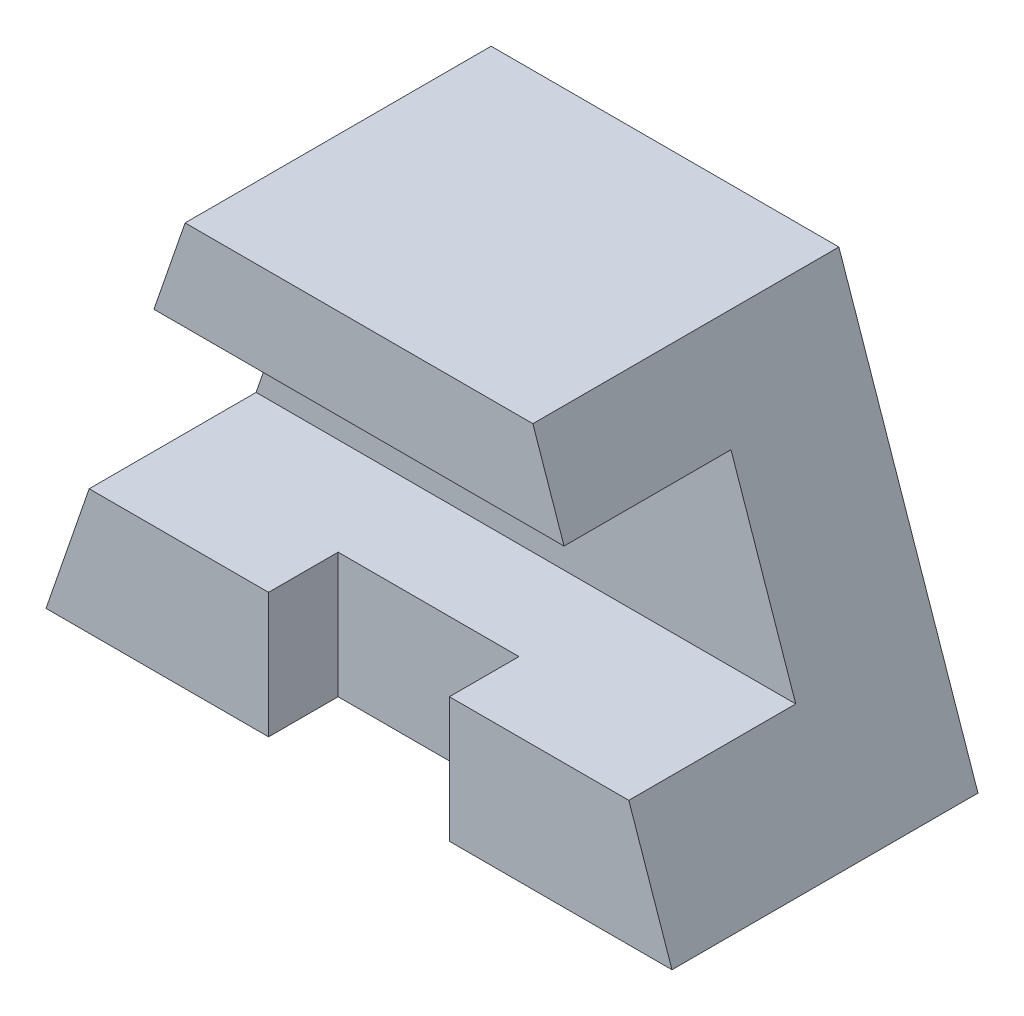
ISO-10303-21;
HEADER;
FILE_DESCRIPTION(('STEP AP214'),'2;1');
FILE_NAME('part.step','',(''),(''),'','','');
FILE_SCHEMA(('AUTOMOTIVE_DESIGN { 1 0 10303 214 1 1 1 1 }'));
ENDSEC;
DATA;
#1=APPLICATION_CONTEXT('core data for automotive mechanical design processes');
#2=APPLICATION_PROTOCOL_DEFINITION('international standard','automotive_design',2000,#1);
#3=PRODUCT_CONTEXT('',#1,'mechanical');
#4=PRODUCT('Part','Part','',(#3));
#5=PRODUCT_RELATED_PRODUCT_CATEGORY('part','',(#4));
#6=PRODUCT_DEFINITION_FORMATION('','',#4);
#7=PRODUCT_DEFINITION_CONTEXT('part definition',#1,'design');
#8=PRODUCT_DEFINITION('design','',#6,#7);
#9=PRODUCT_DEFINITION_SHAPE('','',#8);
#10=(LENGTH_UNIT() NAMED_UNIT(*) SI_UNIT(.MILLI.,.METRE.));
#11=(NAMED_UNIT(*) PLANE_ANGLE_UNIT() SI_UNIT($,.RADIAN.));
#12=(NAMED_UNIT(*) SI_UNIT($,.STERADIAN.) SOLID_ANGLE_UNIT());
#13=UNCERTAINTY_MEASURE_WITH_UNIT(LENGTH_MEASURE(1.E-05),#10,'distance_accuracy_value','');
#14=(GEOMETRIC_REPRESENTATION_CONTEXT(3) GLOBAL_UNCERTAINTY_ASSIGNED_CONTEXT((#13)) GLOBAL_UNIT_ASSIGNED_CONTEXT((#10,
#11,#12)) REPRESENTATION_CONTEXT('',''));
#15=CARTESIAN_POINT('',(0.,0.,0.));
#16=DIRECTION('',(0.,0.,1.));
#17=DIRECTION('',(1.,0.,0.));
#18=AXIS2_PLACEMENT_3D('',#15,#16,#17);
#19=CARTESIAN_POINT('',(0.,0.,44.));
#20=DIRECTION('',(0.,0.,1.));
#21=DIRECTION('',(1.,0.,0.));
#22=AXIS2_PLACEMENT_3D('',#19,#20,#21);
#23=PLANE('',#22);
#24=DIRECTION('',(0.,1.,0.));
#25=VECTOR('',#24,1.);
#26=CARTESIAN_POINT('',(13.,0.,44.));
#27=LINE('',#26,#25);
#28=CARTESIAN_POINT('',(13.,0.,44.));
#29=VERTEX_POINT('',#28);
#30=CARTESIAN_POINT('',(13.,18.,44.));
#31=VERTEX_POINT('',#30);
#32=EDGE_CURVE('E138',#29,#31,#27,.T.);
#33=ORIENTED_EDGE('',*,*,#32,.F.);
#34=DIRECTION('',(1.,0.,0.));
#35=VECTOR('',#34,1.);
#36=CARTESIAN_POINT('',(-45.,0.,44.));
#37=LINE('',#36,#35);
#38=CARTESIAN_POINT('',(45.,0.,44.));
#39=VERTEX_POINT('',#38);
#40=EDGE_CURVE('E172',#29,#39,#37,.T.);
#41=ORIENTED_EDGE('',*,*,#40,.T.);
#42=DIRECTION('',(-0.325990683319404,0.945372981626272,0.));
#43=VECTOR('',#42,1.);
#44=CARTESIAN_POINT('',(45.,0.,44.));
#45=LINE('',#44,#43);
#46=CARTESIAN_POINT('',(38.7931034482758,18.,44.));
#47=VERTEX_POINT('',#46);
#48=EDGE_CURVE('E178',#39,#47,#45,.T.);
#49=ORIENTED_EDGE('',*,*,#48,.T.);
#50=DIRECTION('',(1.,0.,0.));
#51=VECTOR('',#50,1.);
#52=CARTESIAN_POINT('',(0.,18.,44.));
#53=LINE('',#52,#51);
#54=EDGE_CURVE('E203',#31,#47,#53,.T.);
#55=ORIENTED_EDGE('',*,*,#54,.F.);
#56=EDGE_LOOP('',(#33,#41,#49,#55));
#57=FACE_BOUND('',#56,.T.);
#58=ADVANCED_FACE('F33',(#57),#23,.T.);
#59=DIRECTION('',(-1.,0.,0.));
#60=VECTOR('',#59,1.);
#61=CARTESIAN_POINT('',(0.,45.,44.));
#62=LINE('',#61,#60);
#63=CARTESIAN_POINT('',(29.4827586206896,45.,44.));
#64=VERTEX_POINT('',#63);
#65=CARTESIAN_POINT('',(-29.4827586206897,45.,44.));
#66=VERTEX_POINT('',#65);
#67=EDGE_CURVE('E41',#64,#66,#62,.T.);
#68=ORIENTED_EDGE('',*,*,#67,.F.);
#69=CARTESIAN_POINT('',(25.,58.,44.));
#70=VERTEX_POINT('',#69);
#71=EDGE_CURVE('E177',#64,#70,#45,.T.);
#72=ORIENTED_EDGE('',*,*,#71,.T.);
#73=DIRECTION('',(-1.,0.,0.));
#74=VECTOR('',#73,1.);
#75=CARTESIAN_POINT('',(25.,58.,44.));
#76=LINE('',#75,#74);
#77=CARTESIAN_POINT('',(-25.,58.,44.));
#78=VERTEX_POINT('',#77);
#79=EDGE_CURVE('E181',#70,#78,#76,.T.);
#80=ORIENTED_EDGE('',*,*,#79,.T.);
#81=DIRECTION('',(-0.325990683319404,-0.945372981626272,0.));
#82=VECTOR('',#81,1.);
#83=CARTESIAN_POINT('',(-25.,58.,44.));
#84=LINE('',#83,#82);
#85=EDGE_CURVE('E169',#78,#66,#84,.T.);
#86=ORIENTED_EDGE('',*,*,#85,.T.);
#87=EDGE_LOOP('',(#68,#72,#80,#86));
#88=FACE_BOUND('',#87,.T.);
#89=ADVANCED_FACE('F212',(#88),#23,.T.);
#90=CARTESIAN_POINT('',(-25.,58.,44.));
#91=DIRECTION('',(0.945372981626272,-0.325990683319404,0.));
#92=DIRECTION('',(0.325990683319404,0.945372981626272,0.));
#93=AXIS2_PLACEMENT_3D('',#90,#91,#92);
#94=PLANE('',#93);
#95=DIRECTION('',(0.325990683319404,0.945372981626272,0.));
#96=VECTOR('',#95,1.);
#97=CARTESIAN_POINT('',(-25.,58.,20.));
#98=LINE('',#97,#96);
#99=CARTESIAN_POINT('',(-38.7931034482759,18.,20.));
#100=VERTEX_POINT('',#99);
#101=CARTESIAN_POINT('',(-29.4827586206897,45.,20.));
#102=VERTEX_POINT('',#101);
#103=EDGE_CURVE('E165',#100,#102,#98,.T.);
#104=ORIENTED_EDGE('',*,*,#103,.T.);
#105=DIRECTION('',(0.,0.,1.));
#106=VECTOR('',#105,1.);
#107=CARTESIAN_POINT('',(-29.4827586206897,45.,44.));
#108=LINE('',#107,#106);
#109=EDGE_CURVE('E162',#102,#66,#108,.T.);
#110=ORIENTED_EDGE('',*,*,#109,.T.);
#111=ORIENTED_EDGE('',*,*,#85,.F.);
#112=DIRECTION('',(0.,0.,-1.));
#113=VECTOR('',#112,1.);
#114=CARTESIAN_POINT('',(-25.,58.,44.));
#115=LINE('',#114,#113);
#116=CARTESIAN_POINT('',(-25.,58.,0.));
#117=VERTEX_POINT('',#116);
#118=EDGE_CURVE('E183',#78,#117,#115,.T.);
#119=ORIENTED_EDGE('',*,*,#118,.T.);
#120=DIRECTION('',(-0.325990683319404,-0.945372981626272,0.));
#121=VECTOR('',#120,1.);
#122=CARTESIAN_POINT('',(-25.,58.,0.));
#123=LINE('',#122,#121);
#124=CARTESIAN_POINT('',(-45.,0.,0.));
#125=VERTEX_POINT('',#124);
#126=EDGE_CURVE('E168',#117,#125,#123,.T.);
#127=ORIENTED_EDGE('',*,*,#126,.T.);
#128=DIRECTION('',(0.,0.,-1.));
#129=VECTOR('',#128,1.);
#130=CARTESIAN_POINT('',(-45.,0.,44.));
#131=LINE('',#130,#129);
#132=CARTESIAN_POINT('',(-45.,0.,44.));
#133=VERTEX_POINT('',#132);
#134=EDGE_CURVE('E200',#133,#125,#131,.T.);
#135=ORIENTED_EDGE('',*,*,#134,.F.);
#136=CARTESIAN_POINT('',(-38.7931034482759,18.,44.));
#137=VERTEX_POINT('',#136);
#138=EDGE_CURVE('E173',#137,#133,#84,.T.);
#139=ORIENTED_EDGE('',*,*,#138,.F.);
#140=DIRECTION('',(0.,0.,-1.));
#141=VECTOR('',#140,1.);
#142=CARTESIAN_POINT('',(-38.7931034482759,18.,44.));
#143=LINE('',#142,#141);
#144=EDGE_CURVE('E56',#137,#100,#143,.T.);
#145=ORIENTED_EDGE('',*,*,#144,.T.);
#146=EDGE_LOOP('',(#104,#110,#111,#119,#127,#135,#139,#145));
#147=FACE_BOUND('',#146,.T.);
#148=ADVANCED_FACE('F35',(#147),#94,.F.);
#149=CARTESIAN_POINT('',(-45.,0.,44.));
#150=DIRECTION('',(0.,1.,0.));
#151=DIRECTION('',(-1.,0.,0.));
#152=AXIS2_PLACEMENT_3D('',#149,#150,#151);
#153=PLANE('',#152);
#154=ORIENTED_EDGE('',*,*,#40,.F.);
#155=DIRECTION('',(0.,0.,1.));
#156=VECTOR('',#155,1.);
#157=CARTESIAN_POINT('',(13.,0.,34.));
#158=LINE('',#157,#156);
#159=CARTESIAN_POINT('',(13.,0.,34.));
#160=VERTEX_POINT('',#159);
#161=EDGE_CURVE('E143',#160,#29,#158,.T.);
#162=ORIENTED_EDGE('',*,*,#161,.F.);
#163=DIRECTION('',(1.,0.,0.));
#164=VECTOR('',#163,1.);
#165=CARTESIAN_POINT('',(-13.,0.,34.));
#166=LINE('',#165,#164);
#167=CARTESIAN_POINT('',(-13.,0.,34.));
#168=VERTEX_POINT('',#167);
#169=EDGE_CURVE('E132',#168,#160,#166,.T.);
#170=ORIENTED_EDGE('',*,*,#169,.F.);
#171=DIRECTION('',(0.,0.,1.));
#172=VECTOR('',#171,1.);
#173=CARTESIAN_POINT('',(-13.,0.,34.));
#174=LINE('',#173,#172);
#175=CARTESIAN_POINT('',(-13.,0.,44.));
#176=VERTEX_POINT('',#175);
#177=EDGE_CURVE('E130',#168,#176,#174,.T.);
#178=ORIENTED_EDGE('',*,*,#177,.T.);
#179=EDGE_CURVE('E174',#133,#176,#37,.T.);
#180=ORIENTED_EDGE('',*,*,#179,.F.);
#181=ORIENTED_EDGE('',*,*,#134,.T.);
#182=DIRECTION('',(1.,0.,0.));
#183=VECTOR('',#182,1.);
#184=CARTESIAN_POINT('',(-45.,0.,0.));
#185=LINE('',#184,#183);
#186=CARTESIAN_POINT('',(45.,0.,0.));
#187=VERTEX_POINT('',#186);
#188=EDGE_CURVE('E186',#125,#187,#185,.T.);
#189=ORIENTED_EDGE('',*,*,#188,.T.);
#190=DIRECTION('',(0.,0.,-1.));
#191=VECTOR('',#190,1.);
#192=CARTESIAN_POINT('',(45.,0.,44.));
#193=LINE('',#192,#191);
#194=EDGE_CURVE('E197',#39,#187,#193,.T.);
#195=ORIENTED_EDGE('',*,*,#194,.F.);
#196=EDGE_LOOP('',(#154,#162,#170,#178,#180,#181,#189,#195));
#197=FACE_BOUND('',#196,.T.);
#198=ADVANCED_FACE('F228',(#197),#153,.F.);
#199=CARTESIAN_POINT('',(45.,0.,44.));
#200=DIRECTION('',(-0.945372981626272,-0.325990683319404,0.));
#201=DIRECTION('',(0.325990683319404,-0.945372981626272,0.));
#202=AXIS2_PLACEMENT_3D('',#199,#200,#201);
#203=PLANE('',#202);
#204=ORIENTED_EDGE('',*,*,#71,.F.);
#205=DIRECTION('',(0.,0.,-1.));
#206=VECTOR('',#205,1.);
#207=CARTESIAN_POINT('',(29.4827586206897,45.,44.));
#208=LINE('',#207,#206);
#209=CARTESIAN_POINT('',(29.4827586206897,45.,20.));
#210=VERTEX_POINT('',#209);
#211=EDGE_CURVE('E159',#64,#210,#208,.T.);
#212=ORIENTED_EDGE('',*,*,#211,.T.);
#213=DIRECTION('',(0.325990683319404,-0.945372981626272,0.));
#214=VECTOR('',#213,1.);
#215=CARTESIAN_POINT('',(45.,0.,20.));
#216=LINE('',#215,#214);
#217=CARTESIAN_POINT('',(38.7931034482758,18.,20.));
#218=VERTEX_POINT('',#217);
#219=EDGE_CURVE('E11',#210,#218,#216,.T.);
#220=ORIENTED_EDGE('',*,*,#219,.T.);
#221=DIRECTION('',(0.,0.,1.));
#222=VECTOR('',#221,1.);
#223=CARTESIAN_POINT('',(38.7931034482759,18.,44.));
#224=LINE('',#223,#222);
#225=EDGE_CURVE('E151',#218,#47,#224,.T.);
#226=ORIENTED_EDGE('',*,*,#225,.T.);
#227=ORIENTED_EDGE('',*,*,#48,.F.);
#228=ORIENTED_EDGE('',*,*,#194,.T.);
#229=DIRECTION('',(-0.325990683319404,0.945372981626272,0.));
#230=VECTOR('',#229,1.);
#231=CARTESIAN_POINT('',(45.,0.,0.));
#232=LINE('',#231,#230);
#233=CARTESIAN_POINT('',(25.,58.,0.));
#234=VERTEX_POINT('',#233);
#235=EDGE_CURVE('E188',#187,#234,#232,.T.);
#236=ORIENTED_EDGE('',*,*,#235,.T.);
#237=DIRECTION('',(0.,0.,-1.));
#238=VECTOR('',#237,1.);
#239=CARTESIAN_POINT('',(25.,58.,44.));
#240=LINE('',#239,#238);
#241=EDGE_CURVE('E194',#70,#234,#240,.T.);
#242=ORIENTED_EDGE('',*,*,#241,.F.);
#243=EDGE_LOOP('',(#204,#212,#220,#226,#227,#228,#236,#242));
#244=FACE_BOUND('',#243,.T.);
#245=ADVANCED_FACE('F245',(#244),#203,.F.);
#246=CARTESIAN_POINT('',(25.,58.,44.));
#247=DIRECTION('',(0.,-1.,0.));
#248=DIRECTION('',(0.,0.,-1.));
#249=AXIS2_PLACEMENT_3D('',#246,#247,#248);
#250=PLANE('',#249);
#251=DIRECTION('',(-1.,0.,0.));
#252=VECTOR('',#251,1.);
#253=CARTESIAN_POINT('',(25.,58.,0.));
#254=LINE('',#253,#252);
#255=EDGE_CURVE('E190',#234,#117,#254,.T.);
#256=ORIENTED_EDGE('',*,*,#255,.T.);
#257=ORIENTED_EDGE('',*,*,#118,.F.);
#258=ORIENTED_EDGE('',*,*,#79,.F.);
#259=ORIENTED_EDGE('',*,*,#241,.T.);
#260=EDGE_LOOP('',(#256,#257,#258,#259));
#261=FACE_BOUND('',#260,.T.);
#262=ADVANCED_FACE('F217',(#261),#250,.F.);
#263=DIRECTION('',(0.,-1.,0.));
#264=VECTOR('',#263,1.);
#265=CARTESIAN_POINT('',(-13.,18.,44.));
#266=LINE('',#265,#264);
#267=CARTESIAN_POINT('',(-13.,18.,44.));
#268=VERTEX_POINT('',#267);
#269=EDGE_CURVE('E232',#268,#176,#266,.T.);
#270=ORIENTED_EDGE('',*,*,#269,.F.);
#271=EDGE_CURVE('E141',#137,#268,#53,.T.);
#272=ORIENTED_EDGE('',*,*,#271,.F.);
#273=ORIENTED_EDGE('',*,*,#138,.T.);
#274=ORIENTED_EDGE('',*,*,#179,.T.);
#275=EDGE_LOOP('',(#270,#272,#273,#274));
#276=FACE_BOUND('',#275,.T.);
#277=ADVANCED_FACE('F231',(#276),#23,.T.);
#278=CARTESIAN_POINT('',(0.,0.,0.));
#279=DIRECTION('',(0.,0.,1.));
#280=DIRECTION('',(1.,0.,0.));
#281=AXIS2_PLACEMENT_3D('',#278,#279,#280);
#282=PLANE('',#281);
#283=ORIENTED_EDGE('',*,*,#126,.F.);
#284=ORIENTED_EDGE('',*,*,#255,.F.);
#285=ORIENTED_EDGE('',*,*,#235,.F.);
#286=ORIENTED_EDGE('',*,*,#188,.F.);
#287=EDGE_LOOP('',(#283,#284,#285,#286));
#288=FACE_BOUND('',#287,.T.);
#289=ADVANCED_FACE('F222',(#288),#282,.F.);
#290=CARTESIAN_POINT('',(-45.,18.,20.));
#291=DIRECTION('',(0.,0.,-1.));
#292=DIRECTION('',(-1.,0.,0.));
#293=AXIS2_PLACEMENT_3D('',#290,#291,#292);
#294=PLANE('',#293);
#295=DIRECTION('',(1.,0.,0.));
#296=VECTOR('',#295,1.);
#297=CARTESIAN_POINT('',(-45.,18.,20.));
#298=LINE('',#297,#296);
#299=EDGE_CURVE('E152',#100,#218,#298,.T.);
#300=ORIENTED_EDGE('',*,*,#299,.T.);
#301=ORIENTED_EDGE('',*,*,#219,.F.);
#302=DIRECTION('',(1.,0.,0.));
#303=VECTOR('',#302,1.);
#304=CARTESIAN_POINT('',(-45.,45.,20.));
#305=LINE('',#304,#303);
#306=EDGE_CURVE('E148',#102,#210,#305,.T.);
#307=ORIENTED_EDGE('',*,*,#306,.F.);
#308=ORIENTED_EDGE('',*,*,#103,.F.);
#309=EDGE_LOOP('',(#300,#301,#307,#308));
#310=FACE_BOUND('',#309,.T.);
#311=ADVANCED_FACE('F247',(#310),#294,.F.);
#312=CARTESIAN_POINT('',(-45.,45.,20.));
#313=DIRECTION('',(0.,1.,0.));
#314=DIRECTION('',(0.,0.,1.));
#315=AXIS2_PLACEMENT_3D('',#312,#313,#314);
#316=PLANE('',#315);
#317=ORIENTED_EDGE('',*,*,#306,.T.);
#318=ORIENTED_EDGE('',*,*,#211,.F.);
#319=ORIENTED_EDGE('',*,*,#67,.T.);
#320=ORIENTED_EDGE('',*,*,#109,.F.);
#321=EDGE_LOOP('',(#317,#318,#319,#320));
#322=FACE_BOUND('',#321,.T.);
#323=ADVANCED_FACE('F206',(#322),#316,.F.);
#324=CARTESIAN_POINT('',(-45.,18.,44.));
#325=DIRECTION('',(0.,-1.,0.));
#326=DIRECTION('',(0.,0.,-1.));
#327=AXIS2_PLACEMENT_3D('',#324,#325,#326);
#328=PLANE('',#327);
#329=DIRECTION('',(-1.,0.,0.));
#330=VECTOR('',#329,1.);
#331=CARTESIAN_POINT('',(13.,18.,34.));
#332=LINE('',#331,#330);
#333=CARTESIAN_POINT('',(13.,18.,34.));
#334=VERTEX_POINT('',#333);
#335=CARTESIAN_POINT('',(-13.,18.,34.));
#336=VERTEX_POINT('',#335);
#337=EDGE_CURVE('E133',#334,#336,#332,.T.);
#338=ORIENTED_EDGE('',*,*,#337,.F.);
#339=DIRECTION('',(0.,0.,1.));
#340=VECTOR('',#339,1.);
#341=CARTESIAN_POINT('',(13.,18.,34.));
#342=LINE('',#341,#340);
#343=EDGE_CURVE('E155',#334,#31,#342,.T.);
#344=ORIENTED_EDGE('',*,*,#343,.T.);
#345=ORIENTED_EDGE('',*,*,#54,.T.);
#346=ORIENTED_EDGE('',*,*,#225,.F.);
#347=ORIENTED_EDGE('',*,*,#299,.F.);
#348=ORIENTED_EDGE('',*,*,#144,.F.);
#349=ORIENTED_EDGE('',*,*,#271,.T.);
#350=DIRECTION('',(0.,0.,1.));
#351=VECTOR('',#350,1.);
#352=CARTESIAN_POINT('',(-13.,18.,34.));
#353=LINE('',#352,#351);
#354=EDGE_CURVE('E127',#336,#268,#353,.T.);
#355=ORIENTED_EDGE('',*,*,#354,.F.);
#356=EDGE_LOOP('',(#338,#344,#345,#346,#347,#348,#349,#355));
#357=FACE_BOUND('',#356,.T.);
#358=ADVANCED_FACE('F140',(#357),#328,.F.);
#359=CARTESIAN_POINT('',(13.,0.,34.));
#360=DIRECTION('',(1.,0.,0.));
#361=DIRECTION('',(0.,0.,-1.));
#362=AXIS2_PLACEMENT_3D('',#359,#360,#361);
#363=PLANE('',#362);
#364=ORIENTED_EDGE('',*,*,#32,.T.);
#365=ORIENTED_EDGE('',*,*,#343,.F.);
#366=DIRECTION('',(0.,1.,0.));
#367=VECTOR('',#366,1.);
#368=CARTESIAN_POINT('',(13.,0.,34.));
#369=LINE('',#368,#367);
#370=EDGE_CURVE('E48',#160,#334,#369,.T.);
#371=ORIENTED_EDGE('',*,*,#370,.F.);
#372=ORIENTED_EDGE('',*,*,#161,.T.);
#373=EDGE_LOOP('',(#364,#365,#371,#372));
#374=FACE_BOUND('',#373,.T.);
#375=ADVANCED_FACE('F240',(#374),#363,.F.);
#376=CARTESIAN_POINT('',(-13.,18.,34.));
#377=DIRECTION('',(-1.,0.,0.));
#378=DIRECTION('',(0.,-1.,0.));
#379=AXIS2_PLACEMENT_3D('',#376,#377,#378);
#380=PLANE('',#379);
#381=ORIENTED_EDGE('',*,*,#269,.T.);
#382=ORIENTED_EDGE('',*,*,#177,.F.);
#383=DIRECTION('',(0.,-1.,0.));
#384=VECTOR('',#383,1.);
#385=CARTESIAN_POINT('',(-13.,18.,34.));
#386=LINE('',#385,#384);
#387=EDGE_CURVE('E124',#336,#168,#386,.T.);
#388=ORIENTED_EDGE('',*,*,#387,.F.);
#389=ORIENTED_EDGE('',*,*,#354,.T.);
#390=EDGE_LOOP('',(#381,#382,#388,#389));
#391=FACE_BOUND('',#390,.T.);
#392=ADVANCED_FACE('F125',(#391),#380,.F.);
#393=CARTESIAN_POINT('',(0.,0.,34.));
#394=DIRECTION('',(0.,0.,1.));
#395=DIRECTION('',(1.,0.,0.));
#396=AXIS2_PLACEMENT_3D('',#393,#394,#395);
#397=PLANE('',#396);
#398=ORIENTED_EDGE('',*,*,#337,.T.);
#399=ORIENTED_EDGE('',*,*,#387,.T.);
#400=ORIENTED_EDGE('',*,*,#169,.T.);
#401=ORIENTED_EDGE('',*,*,#370,.T.);
#402=EDGE_LOOP('',(#398,#399,#400,#401));
#403=FACE_BOUND('',#402,.T.);
#404=ADVANCED_FACE('F136',(#403),#397,.T.);
#405=CLOSED_SHELL('',(#58,#89,#148,#198,#245,#262,#277,#289,#311,#323,#358,#375,#392,#404));
#406=MANIFOLD_SOLID_BREP('B2',#405);
#407=ADVANCED_BREP_SHAPE_REPRESENTATION('',(#18,#406),#14);
#408=SHAPE_DEFINITION_REPRESENTATION(#9,#407);
ENDSEC;
END-ISO-10303-21;
